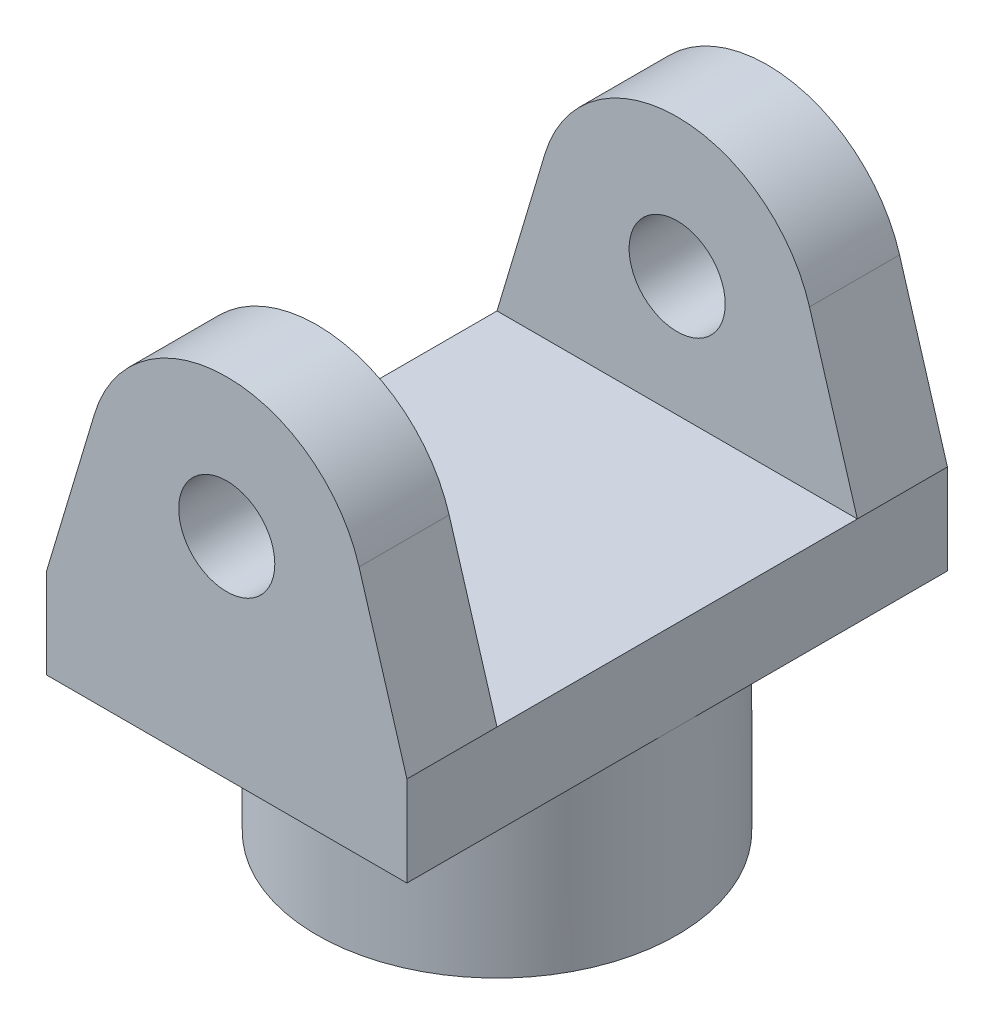
ISO-10303-21;
HEADER;
FILE_DESCRIPTION(('STEP AP214'),'2;1');
FILE_NAME('part.step','',(''),(''),'','','');
FILE_SCHEMA(('AUTOMOTIVE_DESIGN { 1 0 10303 214 1 1 1 1 }'));
ENDSEC;
DATA;
#1=APPLICATION_CONTEXT('core data for automotive mechanical design processes');
#2=APPLICATION_PROTOCOL_DEFINITION('international standard','automotive_design',2000,#1);
#3=PRODUCT_CONTEXT('',#1,'mechanical');
#4=PRODUCT('Part','Part','',(#3));
#5=PRODUCT_RELATED_PRODUCT_CATEGORY('part','',(#4));
#6=PRODUCT_DEFINITION_FORMATION('','',#4);
#7=PRODUCT_DEFINITION_CONTEXT('part definition',#1,'design');
#8=PRODUCT_DEFINITION('design','',#6,#7);
#9=PRODUCT_DEFINITION_SHAPE('','',#8);
#10=(LENGTH_UNIT() NAMED_UNIT(*) SI_UNIT(.MILLI.,.METRE.));
#11=(NAMED_UNIT(*) PLANE_ANGLE_UNIT() SI_UNIT($,.RADIAN.));
#12=(NAMED_UNIT(*) SI_UNIT($,.STERADIAN.) SOLID_ANGLE_UNIT());
#13=UNCERTAINTY_MEASURE_WITH_UNIT(LENGTH_MEASURE(1.E-05),#10,'distance_accuracy_value','');
#14=(GEOMETRIC_REPRESENTATION_CONTEXT(3) GLOBAL_UNCERTAINTY_ASSIGNED_CONTEXT((#13)) GLOBAL_UNIT_ASSIGNED_CONTEXT((#10,
#11,#12)) REPRESENTATION_CONTEXT('',''));
#15=CARTESIAN_POINT('',(0.,0.,0.));
#16=DIRECTION('',(0.,0.,1.));
#17=DIRECTION('',(1.,0.,0.));
#18=AXIS2_PLACEMENT_3D('',#15,#16,#17);
#19=CARTESIAN_POINT('',(0.,-35.,90.));
#20=DIRECTION('',(0.,1.,0.));
#21=DIRECTION('',(0.,0.,1.));
#22=AXIS2_PLACEMENT_3D('',#19,#20,#21);
#23=PLANE('',#22);
#24=CARTESIAN_POINT('',(0.,-35.,45.));
#25=DIRECTION('',(0.,-1.,0.));
#26=DIRECTION('',(0.,0.,-1.));
#27=AXIS2_PLACEMENT_3D('',#24,#25,#26);
#28=CIRCLE('',#27,30.);
#29=CARTESIAN_POINT('',(30.,-35.,45.));
#30=VERTEX_POINT('',#29);
#31=CARTESIAN_POINT('',(-30.,-35.,45.));
#32=VERTEX_POINT('',#31);
#33=EDGE_CURVE('E52',#30,#32,#28,.T.);
#34=ORIENTED_EDGE('',*,*,#33,.F.);
#35=DIRECTION('',(0.,0.,-1.));
#36=VECTOR('',#35,1.);
#37=CARTESIAN_POINT('',(30.,-35.,90.));
#38=LINE('',#37,#36);
#39=CARTESIAN_POINT('',(30.,-35.,90.));
#40=VERTEX_POINT('',#39);
#41=EDGE_CURVE('E325',#40,#30,#38,.T.);
#42=ORIENTED_EDGE('',*,*,#41,.F.);
#43=DIRECTION('',(1.,0.,0.));
#44=VECTOR('',#43,1.);
#45=CARTESIAN_POINT('',(0.,-35.,90.));
#46=LINE('',#45,#44);
#47=CARTESIAN_POINT('',(-30.,-35.,90.));
#48=VERTEX_POINT('',#47);
#49=EDGE_CURVE('E301',#48,#40,#46,.T.);
#50=ORIENTED_EDGE('',*,*,#49,.F.);
#51=DIRECTION('',(0.,0.,-1.));
#52=VECTOR('',#51,1.);
#53=CARTESIAN_POINT('',(-30.,-35.,90.));
#54=LINE('',#53,#52);
#55=EDGE_CURVE('E328',#48,#32,#54,.T.);
#56=ORIENTED_EDGE('',*,*,#55,.T.);
#57=EDGE_LOOP('',(#34,#42,#50,#56));
#58=FACE_BOUND('',#57,.T.);
#59=ADVANCED_FACE('F41',(#58),#23,.F.);
#60=EDGE_CURVE('E11',#32,#30,#28,.T.);
#61=ORIENTED_EDGE('',*,*,#60,.F.);
#62=CARTESIAN_POINT('',(-30.,-35.,0.));
#63=VERTEX_POINT('',#62);
#64=EDGE_CURVE('E327',#32,#63,#54,.T.);
#65=ORIENTED_EDGE('',*,*,#64,.T.);
#66=DIRECTION('',(1.,0.,0.));
#67=VECTOR('',#66,1.);
#68=CARTESIAN_POINT('',(0.,-35.,0.));
#69=LINE('',#68,#67);
#70=CARTESIAN_POINT('',(30.,-35.,0.));
#71=VERTEX_POINT('',#70);
#72=EDGE_CURVE('E313',#63,#71,#69,.T.);
#73=ORIENTED_EDGE('',*,*,#72,.T.);
#74=EDGE_CURVE('E324',#30,#71,#38,.T.);
#75=ORIENTED_EDGE('',*,*,#74,.F.);
#76=EDGE_LOOP('',(#61,#65,#73,#75));
#77=FACE_BOUND('',#76,.T.);
#78=ADVANCED_FACE('F338',(#77),#23,.F.);
#79=CARTESIAN_POINT('',(0.,-20.,90.));
#80=DIRECTION('',(0.,1.,0.));
#81=DIRECTION('',(0.,0.,1.));
#82=AXIS2_PLACEMENT_3D('',#79,#80,#81);
#83=PLANE('',#82);
#84=DIRECTION('',(1.,0.,0.));
#85=VECTOR('',#84,1.);
#86=CARTESIAN_POINT('',(0.,-20.,75.));
#87=LINE('',#86,#85);
#88=CARTESIAN_POINT('',(-30.,-20.,75.));
#89=VERTEX_POINT('',#88);
#90=CARTESIAN_POINT('',(30.,-20.,75.));
#91=VERTEX_POINT('',#90);
#92=EDGE_CURVE('E213',#89,#91,#87,.T.);
#93=ORIENTED_EDGE('',*,*,#92,.T.);
#94=DIRECTION('',(0.,0.,-1.));
#95=VECTOR('',#94,1.);
#96=CARTESIAN_POINT('',(30.,-20.,90.));
#97=LINE('',#96,#95);
#98=CARTESIAN_POINT('',(30.,-20.,15.));
#99=VERTEX_POINT('',#98);
#100=EDGE_CURVE('E309',#91,#99,#97,.T.);
#101=ORIENTED_EDGE('',*,*,#100,.T.);
#102=DIRECTION('',(1.,0.,0.));
#103=VECTOR('',#102,1.);
#104=CARTESIAN_POINT('',(0.,-20.,15.));
#105=LINE('',#104,#103);
#106=CARTESIAN_POINT('',(-30.,-20.,15.));
#107=VERTEX_POINT('',#106);
#108=EDGE_CURVE('E262',#107,#99,#105,.T.);
#109=ORIENTED_EDGE('',*,*,#108,.F.);
#110=DIRECTION('',(0.,0.,-1.));
#111=VECTOR('',#110,1.);
#112=CARTESIAN_POINT('',(-30.,-20.,90.));
#113=LINE('',#112,#111);
#114=EDGE_CURVE('E331',#89,#107,#113,.T.);
#115=ORIENTED_EDGE('',*,*,#114,.F.);
#116=EDGE_LOOP('',(#93,#101,#109,#115));
#117=FACE_BOUND('',#116,.T.);
#118=ADVANCED_FACE('F43',(#117),#83,.T.);
#119=CARTESIAN_POINT('',(-30.,0.,90.));
#120=DIRECTION('',(1.,0.,0.));
#121=DIRECTION('',(0.,1.,0.));
#122=AXIS2_PLACEMENT_3D('',#119,#120,#121);
#123=PLANE('',#122);
#124=DIRECTION('',(0.,-1.,0.));
#125=VECTOR('',#124,1.);
#126=CARTESIAN_POINT('',(-30.,0.,0.));
#127=LINE('',#126,#125);
#128=CARTESIAN_POINT('',(-30.,-20.,0.));
#129=VERTEX_POINT('',#128);
#130=EDGE_CURVE('E297',#129,#63,#127,.T.);
#131=ORIENTED_EDGE('',*,*,#130,.T.);
#132=ORIENTED_EDGE('',*,*,#64,.F.);
#133=ORIENTED_EDGE('',*,*,#55,.F.);
#134=DIRECTION('',(0.,-1.,0.));
#135=VECTOR('',#134,1.);
#136=CARTESIAN_POINT('',(-30.,0.,90.));
#137=LINE('',#136,#135);
#138=CARTESIAN_POINT('',(-30.,-20.,90.));
#139=VERTEX_POINT('',#138);
#140=EDGE_CURVE('E298',#139,#48,#137,.T.);
#141=ORIENTED_EDGE('',*,*,#140,.F.);
#142=EDGE_CURVE('E45',#139,#89,#113,.T.);
#143=ORIENTED_EDGE('',*,*,#142,.T.);
#144=ORIENTED_EDGE('',*,*,#114,.T.);
#145=DIRECTION('',(0.,0.,-1.));
#146=VECTOR('',#145,1.);
#147=CARTESIAN_POINT('',(-30.,-20.,15.));
#148=LINE('',#147,#146);
#149=EDGE_CURVE('E287',#107,#129,#148,.T.);
#150=ORIENTED_EDGE('',*,*,#149,.T.);
#151=EDGE_LOOP('',(#131,#132,#133,#141,#143,#144,#150));
#152=FACE_BOUND('',#151,.T.);
#153=ADVANCED_FACE('F342',(#152),#123,.F.);
#154=CARTESIAN_POINT('',(30.,0.,90.));
#155=DIRECTION('',(1.,0.,0.));
#156=DIRECTION('',(0.,1.,0.));
#157=AXIS2_PLACEMENT_3D('',#154,#155,#156);
#158=PLANE('',#157);
#159=DIRECTION('',(0.,-1.,0.));
#160=VECTOR('',#159,1.);
#161=CARTESIAN_POINT('',(30.,0.,0.));
#162=LINE('',#161,#160);
#163=CARTESIAN_POINT('',(30.,-20.,0.));
#164=VERTEX_POINT('',#163);
#165=EDGE_CURVE('E302',#164,#71,#162,.T.);
#166=ORIENTED_EDGE('',*,*,#165,.F.);
#167=DIRECTION('',(0.,0.,-1.));
#168=VECTOR('',#167,1.);
#169=CARTESIAN_POINT('',(30.,-20.,15.));
#170=LINE('',#169,#168);
#171=EDGE_CURVE('E270',#99,#164,#170,.T.);
#172=ORIENTED_EDGE('',*,*,#171,.F.);
#173=ORIENTED_EDGE('',*,*,#100,.F.);
#174=CARTESIAN_POINT('',(30.,-20.,90.));
#175=VERTEX_POINT('',#174);
#176=EDGE_CURVE('E320',#175,#91,#97,.T.);
#177=ORIENTED_EDGE('',*,*,#176,.F.);
#178=DIRECTION('',(0.,-1.,0.));
#179=VECTOR('',#178,1.);
#180=CARTESIAN_POINT('',(30.,0.,90.));
#181=LINE('',#180,#179);
#182=EDGE_CURVE('E305',#175,#40,#181,.T.);
#183=ORIENTED_EDGE('',*,*,#182,.T.);
#184=ORIENTED_EDGE('',*,*,#41,.T.);
#185=ORIENTED_EDGE('',*,*,#74,.T.);
#186=EDGE_LOOP('',(#166,#172,#173,#177,#183,#184,#185));
#187=FACE_BOUND('',#186,.T.);
#188=ADVANCED_FACE('F352',(#187),#158,.T.);
#189=CARTESIAN_POINT('',(0.,0.,90.));
#190=DIRECTION('',(0.,0.,1.));
#191=DIRECTION('',(1.,0.,0.));
#192=AXIS2_PLACEMENT_3D('',#189,#190,#191);
#193=PLANE('',#192);
#194=ORIENTED_EDGE('',*,*,#182,.F.);
#195=DIRECTION('',(0.286928155857607,-0.957952103905072,0.));
#196=VECTOR('',#195,1.);
#197=CARTESIAN_POINT('',(22.0328983898166,6.59934758472496,90.));
#198=LINE('',#197,#196);
#199=CARTESIAN_POINT('',(22.0328983898166,6.59934758472496,90.));
#200=VERTEX_POINT('',#199);
#201=EDGE_CURVE('E205',#200,#175,#198,.T.);
#202=ORIENTED_EDGE('',*,*,#201,.F.);
#203=CARTESIAN_POINT('',(0.,0.,90.));
#204=DIRECTION('',(0.,0.,1.));
#205=DIRECTION('',(1.,0.,0.));
#206=AXIS2_PLACEMENT_3D('',#203,#204,#205);
#207=CIRCLE('',#206,23.);
#208=CARTESIAN_POINT('',(-22.0328983898166,6.59934758472496,90.));
#209=VERTEX_POINT('',#208);
#210=EDGE_CURVE('E237',#200,#209,#207,.T.);
#211=ORIENTED_EDGE('',*,*,#210,.T.);
#212=DIRECTION('',(-0.286928155857607,-0.957952103905072,0.));
#213=VECTOR('',#212,1.);
#214=CARTESIAN_POINT('',(-22.0328983898166,6.59934758472496,90.));
#215=LINE('',#214,#213);
#216=EDGE_CURVE('E233',#209,#139,#215,.T.);
#217=ORIENTED_EDGE('',*,*,#216,.T.);
#218=ORIENTED_EDGE('',*,*,#140,.T.);
#219=ORIENTED_EDGE('',*,*,#49,.T.);
#220=EDGE_LOOP('',(#194,#202,#211,#217,#218,#219));
#221=FACE_BOUND('',#220,.T.);
#222=CARTESIAN_POINT('',(0.,0.,90.));
#223=DIRECTION('',(0.,0.,1.));
#224=DIRECTION('',(1.,0.,0.));
#225=AXIS2_PLACEMENT_3D('',#222,#223,#224);
#226=CIRCLE('',#225,8.);
#227=CARTESIAN_POINT('',(8.,0.,90.));
#228=VERTEX_POINT('',#227);
#229=EDGE_CURVE('E214',#228,#228,#226,.T.);
#230=ORIENTED_EDGE('',*,*,#229,.F.);
#231=EDGE_LOOP('',(#230));
#232=FACE_BOUND('',#231,.T.);
#233=ADVANCED_FACE('F381',(#221,#232),#193,.T.);
#234=CARTESIAN_POINT('',(0.,0.,0.));
#235=DIRECTION('',(0.,0.,1.));
#236=DIRECTION('',(1.,0.,0.));
#237=AXIS2_PLACEMENT_3D('',#234,#235,#236);
#238=PLANE('',#237);
#239=ORIENTED_EDGE('',*,*,#130,.F.);
#240=DIRECTION('',(-0.286928155857607,-0.957952103905072,0.));
#241=VECTOR('',#240,1.);
#242=CARTESIAN_POINT('',(-22.0328983898166,6.59934758472496,0.));
#243=LINE('',#242,#241);
#244=CARTESIAN_POINT('',(-22.0328983898166,6.59934758472496,0.));
#245=VERTEX_POINT('',#244);
#246=EDGE_CURVE('E277',#245,#129,#243,.T.);
#247=ORIENTED_EDGE('',*,*,#246,.F.);
#248=CARTESIAN_POINT('',(0.,0.,0.));
#249=DIRECTION('',(0.,0.,1.));
#250=DIRECTION('',(1.,0.,0.));
#251=AXIS2_PLACEMENT_3D('',#248,#249,#250);
#252=CIRCLE('',#251,23.);
#253=CARTESIAN_POINT('',(22.0328983898166,6.59934758472496,0.));
#254=VERTEX_POINT('',#253);
#255=EDGE_CURVE('E274',#254,#245,#252,.T.);
#256=ORIENTED_EDGE('',*,*,#255,.F.);
#257=DIRECTION('',(0.286928155857607,-0.957952103905072,0.));
#258=VECTOR('',#257,1.);
#259=CARTESIAN_POINT('',(22.0328983898166,6.59934758472496,0.));
#260=LINE('',#259,#258);
#261=EDGE_CURVE('E249',#254,#164,#260,.T.);
#262=ORIENTED_EDGE('',*,*,#261,.T.);
#263=ORIENTED_EDGE('',*,*,#165,.T.);
#264=ORIENTED_EDGE('',*,*,#72,.F.);
#265=EDGE_LOOP('',(#239,#247,#256,#262,#263,#264));
#266=FACE_BOUND('',#265,.T.);
#267=CARTESIAN_POINT('',(0.,0.,0.));
#268=DIRECTION('',(0.,0.,1.));
#269=DIRECTION('',(1.,0.,0.));
#270=AXIS2_PLACEMENT_3D('',#267,#268,#269);
#271=CIRCLE('',#270,8.);
#272=CARTESIAN_POINT('',(8.,0.,0.));
#273=VERTEX_POINT('',#272);
#274=EDGE_CURVE('E255',#273,#273,#271,.T.);
#275=ORIENTED_EDGE('',*,*,#274,.T.);
#276=EDGE_LOOP('',(#275));
#277=FACE_BOUND('',#276,.T.);
#278=ADVANCED_FACE('F346',(#266,#277),#238,.F.);
#279=CARTESIAN_POINT('',(22.0328983898166,6.59934758472496,15.));
#280=DIRECTION('',(0.957952103905071,0.286928155857607,0.));
#281=DIRECTION('',(-0.286928155857607,0.957952103905071,0.));
#282=AXIS2_PLACEMENT_3D('',#279,#280,#281);
#283=PLANE('',#282);
#284=ORIENTED_EDGE('',*,*,#261,.F.);
#285=DIRECTION('',(0.,0.,-1.));
#286=VECTOR('',#285,1.);
#287=CARTESIAN_POINT('',(22.0328983898166,6.59934758472496,15.));
#288=LINE('',#287,#286);
#289=CARTESIAN_POINT('',(22.0328983898166,6.59934758472496,15.));
#290=VERTEX_POINT('',#289);
#291=EDGE_CURVE('E294',#290,#254,#288,.T.);
#292=ORIENTED_EDGE('',*,*,#291,.F.);
#293=DIRECTION('',(0.286928155857607,-0.957952103905072,0.));
#294=VECTOR('',#293,1.);
#295=CARTESIAN_POINT('',(22.0328983898166,6.59934758472496,15.));
#296=LINE('',#295,#294);
#297=EDGE_CURVE('E250',#290,#99,#296,.T.);
#298=ORIENTED_EDGE('',*,*,#297,.T.);
#299=ORIENTED_EDGE('',*,*,#171,.T.);
#300=EDGE_LOOP('',(#284,#292,#298,#299));
#301=FACE_BOUND('',#300,.T.);
#302=ADVANCED_FACE('F355',(#301),#283,.T.);
#303=CARTESIAN_POINT('',(0.,0.,15.));
#304=DIRECTION('',(0.,0.,-1.));
#305=DIRECTION('',(-1.,0.,0.));
#306=AXIS2_PLACEMENT_3D('',#303,#304,#305);
#307=CYLINDRICAL_SURFACE('',#306,23.);
#308=ORIENTED_EDGE('',*,*,#255,.T.);
#309=DIRECTION('',(0.,0.,-1.));
#310=VECTOR('',#309,1.);
#311=CARTESIAN_POINT('',(-22.0328983898166,6.59934758472496,15.));
#312=LINE('',#311,#310);
#313=CARTESIAN_POINT('',(-22.0328983898166,6.59934758472496,15.));
#314=VERTEX_POINT('',#313);
#315=EDGE_CURVE('E290',#314,#245,#312,.T.);
#316=ORIENTED_EDGE('',*,*,#315,.F.);
#317=CARTESIAN_POINT('',(0.,0.,15.));
#318=DIRECTION('',(0.,0.,1.));
#319=DIRECTION('',(1.,0.,0.));
#320=AXIS2_PLACEMENT_3D('',#317,#318,#319);
#321=CIRCLE('',#320,23.);
#322=EDGE_CURVE('E254',#290,#314,#321,.T.);
#323=ORIENTED_EDGE('',*,*,#322,.F.);
#324=ORIENTED_EDGE('',*,*,#291,.T.);
#325=EDGE_LOOP('',(#308,#316,#323,#324));
#326=FACE_BOUND('',#325,.T.);
#327=ADVANCED_FACE('F554',(#326),#307,.T.);
#328=CARTESIAN_POINT('',(-22.0328983898166,6.59934758472496,15.));
#329=DIRECTION('',(0.957952103905071,-0.286928155857607,0.));
#330=DIRECTION('',(0.286928155857607,0.957952103905071,0.));
#331=AXIS2_PLACEMENT_3D('',#328,#329,#330);
#332=PLANE('',#331);
#333=ORIENTED_EDGE('',*,*,#246,.T.);
#334=ORIENTED_EDGE('',*,*,#149,.F.);
#335=DIRECTION('',(-0.286928155857607,-0.957952103905072,0.));
#336=VECTOR('',#335,1.);
#337=CARTESIAN_POINT('',(-22.0328983898166,6.59934758472496,15.));
#338=LINE('',#337,#336);
#339=EDGE_CURVE('E258',#314,#107,#338,.T.);
#340=ORIENTED_EDGE('',*,*,#339,.F.);
#341=ORIENTED_EDGE('',*,*,#315,.T.);
#342=EDGE_LOOP('',(#333,#334,#340,#341));
#343=FACE_BOUND('',#342,.T.);
#344=ADVANCED_FACE('F544',(#343),#332,.F.);
#345=CARTESIAN_POINT('',(0.,0.,15.));
#346=DIRECTION('',(0.,0.,-1.));
#347=DIRECTION('',(-1.,0.,0.));
#348=AXIS2_PLACEMENT_3D('',#345,#346,#347);
#349=CYLINDRICAL_SURFACE('',#348,8.);
#350=CARTESIAN_POINT('',(0.,0.,15.));
#351=DIRECTION('',(0.,0.,1.));
#352=DIRECTION('',(1.,0.,0.));
#353=AXIS2_PLACEMENT_3D('',#350,#351,#352);
#354=CIRCLE('',#353,8.);
#355=CARTESIAN_POINT('',(8.,0.,15.));
#356=VERTEX_POINT('',#355);
#357=EDGE_CURVE('E266',#356,#356,#354,.T.);
#358=ORIENTED_EDGE('',*,*,#357,.T.);
#359=EDGE_LOOP('',(#358));
#360=FACE_BOUND('',#359,.T.);
#361=ORIENTED_EDGE('',*,*,#274,.F.);
#362=EDGE_LOOP('',(#361));
#363=FACE_BOUND('',#362,.T.);
#364=ADVANCED_FACE('F535',(#360,#363),#349,.F.);
#365=CARTESIAN_POINT('',(0.,0.,15.));
#366=DIRECTION('',(0.,0.,1.));
#367=DIRECTION('',(1.,0.,0.));
#368=AXIS2_PLACEMENT_3D('',#365,#366,#367);
#369=PLANE('',#368);
#370=ORIENTED_EDGE('',*,*,#297,.F.);
#371=ORIENTED_EDGE('',*,*,#322,.T.);
#372=ORIENTED_EDGE('',*,*,#339,.T.);
#373=ORIENTED_EDGE('',*,*,#108,.T.);
#374=EDGE_LOOP('',(#370,#371,#372,#373));
#375=FACE_BOUND('',#374,.T.);
#376=ORIENTED_EDGE('',*,*,#357,.F.);
#377=EDGE_LOOP('',(#376));
#378=FACE_BOUND('',#377,.T.);
#379=ADVANCED_FACE('F359',(#375,#378),#369,.T.);
#380=CARTESIAN_POINT('',(22.0328983898166,6.59934758472496,75.));
#381=DIRECTION('',(-0.957952103905071,-0.286928155857607,0.));
#382=DIRECTION('',(0.286928155857607,-0.957952103905071,0.));
#383=AXIS2_PLACEMENT_3D('',#380,#381,#382);
#384=PLANE('',#383);
#385=ORIENTED_EDGE('',*,*,#201,.T.);
#386=ORIENTED_EDGE('',*,*,#176,.T.);
#387=DIRECTION('',(0.286928155857607,-0.957952103905072,0.));
#388=VECTOR('',#387,1.);
#389=CARTESIAN_POINT('',(22.0328983898166,6.59934758472496,75.));
#390=LINE('',#389,#388);
#391=CARTESIAN_POINT('',(22.0328983898166,6.59934758472496,75.));
#392=VERTEX_POINT('',#391);
#393=EDGE_CURVE('E209',#392,#91,#390,.T.);
#394=ORIENTED_EDGE('',*,*,#393,.F.);
#395=DIRECTION('',(0.,0.,1.));
#396=VECTOR('',#395,1.);
#397=CARTESIAN_POINT('',(22.0328983898166,6.59934758472496,75.));
#398=LINE('',#397,#396);
#399=EDGE_CURVE('E229',#392,#200,#398,.T.);
#400=ORIENTED_EDGE('',*,*,#399,.T.);
#401=EDGE_LOOP('',(#385,#386,#394,#400));
#402=FACE_BOUND('',#401,.T.);
#403=ADVANCED_FACE('F377',(#402),#384,.F.);
#404=CARTESIAN_POINT('',(-22.0328983898166,6.59934758472496,75.));
#405=DIRECTION('',(-0.957952103905071,0.286928155857607,0.));
#406=DIRECTION('',(-0.286928155857607,-0.957952103905071,0.));
#407=AXIS2_PLACEMENT_3D('',#404,#405,#406);
#408=PLANE('',#407);
#409=ORIENTED_EDGE('',*,*,#216,.F.);
#410=DIRECTION('',(0.,0.,1.));
#411=VECTOR('',#410,1.);
#412=CARTESIAN_POINT('',(-22.0328983898166,6.59934758472496,75.));
#413=LINE('',#412,#411);
#414=CARTESIAN_POINT('',(-22.0328983898166,6.59934758472496,75.));
#415=VERTEX_POINT('',#414);
#416=EDGE_CURVE('E246',#415,#209,#413,.T.);
#417=ORIENTED_EDGE('',*,*,#416,.F.);
#418=DIRECTION('',(-0.286928155857607,-0.957952103905072,0.));
#419=VECTOR('',#418,1.);
#420=CARTESIAN_POINT('',(-22.0328983898166,6.59934758472496,75.));
#421=LINE('',#420,#419);
#422=EDGE_CURVE('E217',#415,#89,#421,.T.);
#423=ORIENTED_EDGE('',*,*,#422,.T.);
#424=ORIENTED_EDGE('',*,*,#142,.F.);
#425=EDGE_LOOP('',(#409,#417,#423,#424));
#426=FACE_BOUND('',#425,.T.);
#427=ADVANCED_FACE('F388',(#426),#408,.T.);
#428=CARTESIAN_POINT('',(0.,0.,75.));
#429=DIRECTION('',(0.,0.,1.));
#430=DIRECTION('',(1.,0.,0.));
#431=AXIS2_PLACEMENT_3D('',#428,#429,#430);
#432=CYLINDRICAL_SURFACE('',#431,23.);
#433=ORIENTED_EDGE('',*,*,#210,.F.);
#434=ORIENTED_EDGE('',*,*,#399,.F.);
#435=CARTESIAN_POINT('',(0.,0.,75.));
#436=DIRECTION('',(0.,0.,1.));
#437=DIRECTION('',(1.,0.,0.));
#438=AXIS2_PLACEMENT_3D('',#435,#436,#437);
#439=CIRCLE('',#438,23.);
#440=EDGE_CURVE('E221',#392,#415,#439,.T.);
#441=ORIENTED_EDGE('',*,*,#440,.T.);
#442=ORIENTED_EDGE('',*,*,#416,.T.);
#443=EDGE_LOOP('',(#433,#434,#441,#442));
#444=FACE_BOUND('',#443,.T.);
#445=ADVANCED_FACE('F384',(#444),#432,.T.);
#446=CARTESIAN_POINT('',(0.,0.,75.));
#447=DIRECTION('',(0.,0.,1.));
#448=DIRECTION('',(1.,0.,0.));
#449=AXIS2_PLACEMENT_3D('',#446,#447,#448);
#450=CYLINDRICAL_SURFACE('',#449,8.);
#451=CARTESIAN_POINT('',(0.,0.,75.));
#452=DIRECTION('',(0.,0.,1.));
#453=DIRECTION('',(1.,0.,0.));
#454=AXIS2_PLACEMENT_3D('',#451,#452,#453);
#455=CIRCLE('',#454,8.);
#456=CARTESIAN_POINT('',(8.,0.,75.));
#457=VERTEX_POINT('',#456);
#458=EDGE_CURVE('E225',#457,#457,#455,.T.);
#459=ORIENTED_EDGE('',*,*,#458,.F.);
#460=EDGE_LOOP('',(#459));
#461=FACE_BOUND('',#460,.T.);
#462=ORIENTED_EDGE('',*,*,#229,.T.);
#463=EDGE_LOOP('',(#462));
#464=FACE_BOUND('',#463,.T.);
#465=ADVANCED_FACE('F481',(#461,#464),#450,.F.);
#466=CARTESIAN_POINT('',(0.,0.,75.));
#467=DIRECTION('',(0.,0.,-1.));
#468=DIRECTION('',(1.,0.,0.));
#469=AXIS2_PLACEMENT_3D('',#466,#467,#468);
#470=PLANE('',#469);
#471=ORIENTED_EDGE('',*,*,#393,.T.);
#472=ORIENTED_EDGE('',*,*,#92,.F.);
#473=ORIENTED_EDGE('',*,*,#422,.F.);
#474=ORIENTED_EDGE('',*,*,#440,.F.);
#475=EDGE_LOOP('',(#471,#472,#473,#474));
#476=FACE_BOUND('',#475,.T.);
#477=ORIENTED_EDGE('',*,*,#458,.T.);
#478=EDGE_LOOP('',(#477));
#479=FACE_BOUND('',#478,.T.);
#480=ADVANCED_FACE('F373',(#476,#479),#470,.T.);
#481=CARTESIAN_POINT('',(0.,-65.,45.));
#482=DIRECTION('',(0.,-1.,0.));
#483=DIRECTION('',(0.,0.,-1.));
#484=AXIS2_PLACEMENT_3D('',#481,#482,#483);
#485=PLANE('',#484);
#486=CARTESIAN_POINT('',(0.,-65.,45.));
#487=DIRECTION('',(0.,-1.,0.));
#488=DIRECTION('',(0.,0.,-1.));
#489=AXIS2_PLACEMENT_3D('',#486,#487,#488);
#490=CIRCLE('',#489,30.);
#491=CARTESIAN_POINT('',(0.,-65.,15.));
#492=VERTEX_POINT('',#491);
#493=EDGE_CURVE('E202',#492,#492,#490,.T.);
#494=ORIENTED_EDGE('',*,*,#493,.T.);
#495=EDGE_LOOP('',(#494));
#496=FACE_BOUND('',#495,.T.);
#497=DIRECTION('',(0.,0.,1.));
#498=VECTOR('',#497,1.);
#499=CARTESIAN_POINT('',(2.,-65.,65.8660687473185));
#500=LINE('',#499,#498);
#501=CARTESIAN_POINT('',(2.,-65.,59.8660687473185));
#502=VERTEX_POINT('',#501);
#503=CARTESIAN_POINT('',(2.,-65.,65.8660687473185));
#504=VERTEX_POINT('',#503);
#505=EDGE_CURVE('E160',#502,#504,#500,.T.);
#506=ORIENTED_EDGE('',*,*,#505,.F.);
#507=CARTESIAN_POINT('',(0.,-65.,45.));
#508=DIRECTION('',(0.,-1.,0.));
#509=DIRECTION('',(0.,0.,-1.));
#510=AXIS2_PLACEMENT_3D('',#507,#508,#509);
#511=CIRCLE('',#510,15.);
#512=CARTESIAN_POINT('',(-2.,-65.,59.8660687473185));
#513=VERTEX_POINT('',#512);
#514=EDGE_CURVE('E151',#513,#502,#511,.T.);
#515=ORIENTED_EDGE('',*,*,#514,.F.);
#516=DIRECTION('',(0.,0.,-1.));
#517=VECTOR('',#516,1.);
#518=CARTESIAN_POINT('',(-2.,-65.,59.8660687473185));
#519=LINE('',#518,#517);
#520=CARTESIAN_POINT('',(-2.,-65.,65.8660687473185));
#521=VERTEX_POINT('',#520);
#522=EDGE_CURVE('E178',#521,#513,#519,.T.);
#523=ORIENTED_EDGE('',*,*,#522,.F.);
#524=DIRECTION('',(-1.,0.,0.));
#525=VECTOR('',#524,1.);
#526=CARTESIAN_POINT('',(-2.,-65.,65.8660687473185));
#527=LINE('',#526,#525);
#528=EDGE_CURVE('E174',#504,#521,#527,.T.);
#529=ORIENTED_EDGE('',*,*,#528,.F.);
#530=EDGE_LOOP('',(#506,#515,#523,#529));
#531=FACE_BOUND('',#530,.T.);
#532=ADVANCED_FACE('F172',(#496,#531),#485,.T.);
#533=CARTESIAN_POINT('',(0.,-65.,45.));
#534=DIRECTION('',(0.,1.,0.));
#535=DIRECTION('',(0.,0.,1.));
#536=AXIS2_PLACEMENT_3D('',#533,#534,#535);
#537=CYLINDRICAL_SURFACE('',#536,30.);
#538=ORIENTED_EDGE('',*,*,#493,.F.);
#539=EDGE_LOOP('',(#538));
#540=FACE_BOUND('',#539,.T.);
#541=ORIENTED_EDGE('',*,*,#33,.T.);
#542=ORIENTED_EDGE('',*,*,#60,.T.);
#543=EDGE_LOOP('',(#541,#542));
#544=FACE_BOUND('',#543,.T.);
#545=ADVANCED_FACE('F391',(#540,#544),#537,.T.);
#546=CARTESIAN_POINT('',(0.,-65.,45.));
#547=DIRECTION('',(0.,1.,0.));
#548=DIRECTION('',(0.,0.,1.));
#549=AXIS2_PLACEMENT_3D('',#546,#547,#548);
#550=CYLINDRICAL_SURFACE('',#549,15.);
#551=CARTESIAN_POINT('',(0.,-35.,45.));
#552=DIRECTION('',(0.,-1.,0.));
#553=DIRECTION('',(0.,0.,-1.));
#554=AXIS2_PLACEMENT_3D('',#551,#552,#553);
#555=CIRCLE('',#554,15.);
#556=CARTESIAN_POINT('',(-2.,-35.,59.8660687473185));
#557=VERTEX_POINT('',#556);
#558=CARTESIAN_POINT('',(2.,-35.,59.8660687473185));
#559=VERTEX_POINT('',#558);
#560=EDGE_CURVE('E183',#557,#559,#555,.T.);
#561=ORIENTED_EDGE('',*,*,#560,.F.);
#562=DIRECTION('',(0.,1.,0.));
#563=VECTOR('',#562,1.);
#564=CARTESIAN_POINT('',(-2.,-65.,59.8660687473185));
#565=LINE('',#564,#563);
#566=EDGE_CURVE('E59',#513,#557,#565,.T.);
#567=ORIENTED_EDGE('',*,*,#566,.F.);
#568=ORIENTED_EDGE('',*,*,#514,.T.);
#569=DIRECTION('',(0.,1.,0.));
#570=VECTOR('',#569,1.);
#571=CARTESIAN_POINT('',(2.,-65.,59.8660687473185));
#572=LINE('',#571,#570);
#573=EDGE_CURVE('E154',#502,#559,#572,.T.);
#574=ORIENTED_EDGE('',*,*,#573,.T.);
#575=EDGE_LOOP('',(#561,#567,#568,#574));
#576=FACE_BOUND('',#575,.T.);
#577=ADVANCED_FACE('F153',(#576),#550,.F.);
#578=CARTESIAN_POINT('',(2.,-65.,65.8660687473185));
#579=DIRECTION('',(-1.,0.,0.));
#580=DIRECTION('',(0.,0.,1.));
#581=AXIS2_PLACEMENT_3D('',#578,#579,#580);
#582=PLANE('',#581);
#583=DIRECTION('',(0.,0.,1.));
#584=VECTOR('',#583,1.);
#585=CARTESIAN_POINT('',(2.,-35.,65.8660687473185));
#586=LINE('',#585,#584);
#587=CARTESIAN_POINT('',(2.,-35.,65.8660687473185));
#588=VERTEX_POINT('',#587);
#589=EDGE_CURVE('E167',#559,#588,#586,.T.);
#590=ORIENTED_EDGE('',*,*,#589,.F.);
#591=ORIENTED_EDGE('',*,*,#573,.F.);
#592=ORIENTED_EDGE('',*,*,#505,.T.);
#593=DIRECTION('',(0.,1.,0.));
#594=VECTOR('',#593,1.);
#595=CARTESIAN_POINT('',(2.,-65.,65.8660687473185));
#596=LINE('',#595,#594);
#597=EDGE_CURVE('E169',#504,#588,#596,.T.);
#598=ORIENTED_EDGE('',*,*,#597,.T.);
#599=EDGE_LOOP('',(#590,#591,#592,#598));
#600=FACE_BOUND('',#599,.T.);
#601=ADVANCED_FACE('F164',(#600),#582,.T.);
#602=CARTESIAN_POINT('',(-2.,-65.,65.8660687473185));
#603=DIRECTION('',(0.,0.,-1.));
#604=DIRECTION('',(-1.,0.,0.));
#605=AXIS2_PLACEMENT_3D('',#602,#603,#604);
#606=PLANE('',#605);
#607=DIRECTION('',(-1.,0.,0.));
#608=VECTOR('',#607,1.);
#609=CARTESIAN_POINT('',(-2.,-35.,65.8660687473185));
#610=LINE('',#609,#608);
#611=CARTESIAN_POINT('',(-2.,-35.,65.8660687473185));
#612=VERTEX_POINT('',#611);
#613=EDGE_CURVE('E188',#588,#612,#610,.T.);
#614=ORIENTED_EDGE('',*,*,#613,.F.);
#615=ORIENTED_EDGE('',*,*,#597,.F.);
#616=ORIENTED_EDGE('',*,*,#528,.T.);
#617=DIRECTION('',(0.,1.,0.));
#618=VECTOR('',#617,1.);
#619=CARTESIAN_POINT('',(-2.,-65.,65.8660687473185));
#620=LINE('',#619,#618);
#621=EDGE_CURVE('E197',#521,#612,#620,.T.);
#622=ORIENTED_EDGE('',*,*,#621,.T.);
#623=EDGE_LOOP('',(#614,#615,#616,#622));
#624=FACE_BOUND('',#623,.T.);
#625=ADVANCED_FACE('F417',(#624),#606,.T.);
#626=CARTESIAN_POINT('',(-2.,-65.,59.8660687473185));
#627=DIRECTION('',(1.,0.,0.));
#628=DIRECTION('',(0.,0.,-1.));
#629=AXIS2_PLACEMENT_3D('',#626,#627,#628);
#630=PLANE('',#629);
#631=DIRECTION('',(0.,0.,-1.));
#632=VECTOR('',#631,1.);
#633=CARTESIAN_POINT('',(-2.,-35.,59.8660687473185));
#634=LINE('',#633,#632);
#635=EDGE_CURVE('E161',#612,#557,#634,.T.);
#636=ORIENTED_EDGE('',*,*,#635,.F.);
#637=ORIENTED_EDGE('',*,*,#621,.F.);
#638=ORIENTED_EDGE('',*,*,#522,.T.);
#639=ORIENTED_EDGE('',*,*,#566,.T.);
#640=EDGE_LOOP('',(#636,#637,#638,#639));
#641=FACE_BOUND('',#640,.T.);
#642=ADVANCED_FACE('F412',(#641),#630,.T.);
#643=ORIENTED_EDGE('',*,*,#635,.T.);
#644=ORIENTED_EDGE('',*,*,#560,.T.);
#645=ORIENTED_EDGE('',*,*,#589,.T.);
#646=ORIENTED_EDGE('',*,*,#613,.T.);
#647=EDGE_LOOP('',(#643,#644,#645,#646));
#648=FACE_BOUND('',#647,.T.);
#649=ADVANCED_FACE('F406',(#648),#23,.F.);
#650=CLOSED_SHELL('',(#59,#78,#118,#153,#188,#233,#278,#302,#327,#344,#364,#379,#403,#427,#445,
#465,#480,#532,#545,#577,#601,#625,#642,#649));
#651=MANIFOLD_SOLID_BREP('B2',#650);
#652=ADVANCED_BREP_SHAPE_REPRESENTATION('',(#18,#651),#14);
#653=SHAPE_DEFINITION_REPRESENTATION(#9,#652);
ENDSEC;
END-ISO-10303-21;
